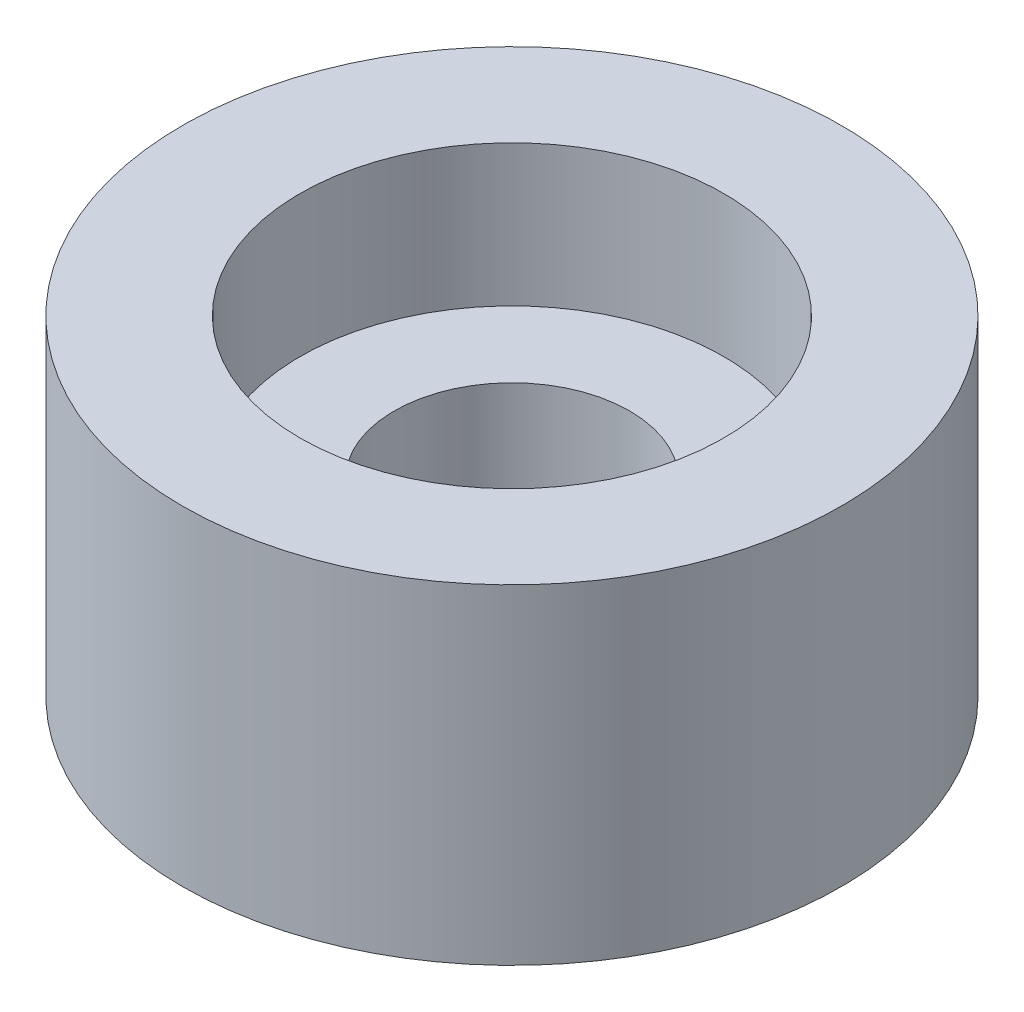
ISO-10303-21;
HEADER;
FILE_DESCRIPTION(('STEP AP214'),'2;1');
FILE_NAME('part.step','',(''),(''),'','','');
FILE_SCHEMA(('AUTOMOTIVE_DESIGN { 1 0 10303 214 1 1 1 1 }'));
ENDSEC;
DATA;
#1=APPLICATION_CONTEXT('core data for automotive mechanical design processes');
#2=APPLICATION_PROTOCOL_DEFINITION('international standard','automotive_design',2000,#1);
#3=PRODUCT_CONTEXT('',#1,'mechanical');
#4=PRODUCT('Part','Part','',(#3));
#5=PRODUCT_RELATED_PRODUCT_CATEGORY('part','',(#4));
#6=PRODUCT_DEFINITION_FORMATION('','',#4);
#7=PRODUCT_DEFINITION_CONTEXT('part definition',#1,'design');
#8=PRODUCT_DEFINITION('design','',#6,#7);
#9=PRODUCT_DEFINITION_SHAPE('','',#8);
#10=(LENGTH_UNIT() NAMED_UNIT(*) SI_UNIT(.MILLI.,.METRE.));
#11=(NAMED_UNIT(*) PLANE_ANGLE_UNIT() SI_UNIT($,.RADIAN.));
#12=(NAMED_UNIT(*) SI_UNIT($,.STERADIAN.) SOLID_ANGLE_UNIT());
#13=UNCERTAINTY_MEASURE_WITH_UNIT(LENGTH_MEASURE(1.E-05),#10,'distance_accuracy_value','');
#14=(GEOMETRIC_REPRESENTATION_CONTEXT(3) GLOBAL_UNCERTAINTY_ASSIGNED_CONTEXT((#13)) GLOBAL_UNIT_ASSIGNED_CONTEXT((#10,
#11,#12)) REPRESENTATION_CONTEXT('',''));
#15=CARTESIAN_POINT('',(0.,0.,0.));
#16=DIRECTION('',(0.,0.,1.));
#17=DIRECTION('',(1.,0.,0.));
#18=AXIS2_PLACEMENT_3D('',#15,#16,#17);
#19=CARTESIAN_POINT('',(0.,2.,0.));
#20=DIRECTION('',(0.,-1.,0.));
#21=DIRECTION('',(0.,0.,-1.));
#22=AXIS2_PLACEMENT_3D('',#19,#20,#21);
#23=CYLINDRICAL_SURFACE('',#22,3.5);
#24=CARTESIAN_POINT('',(0.,0.,0.));
#25=DIRECTION('',(0.,1.,0.));
#26=DIRECTION('',(0.,0.,1.));
#27=AXIS2_PLACEMENT_3D('',#24,#25,#26);
#28=CIRCLE('',#27,3.5);
#29=CARTESIAN_POINT('',(0.,0.,3.5));
#30=VERTEX_POINT('',#29);
#31=EDGE_CURVE('E39',#30,#30,#28,.T.);
#32=ORIENTED_EDGE('',*,*,#31,.T.);
#33=EDGE_LOOP('',(#32));
#34=FACE_BOUND('',#33,.T.);
#35=CARTESIAN_POINT('',(0.,3.5,0.));
#36=DIRECTION('',(0.,1.,0.));
#37=DIRECTION('',(0.,0.,1.));
#38=AXIS2_PLACEMENT_3D('',#35,#36,#37);
#39=CIRCLE('',#38,3.5);
#40=CARTESIAN_POINT('',(0.,3.5,3.5));
#41=VERTEX_POINT('',#40);
#42=EDGE_CURVE('E43',#41,#41,#39,.T.);
#43=ORIENTED_EDGE('',*,*,#42,.F.);
#44=EDGE_LOOP('',(#43));
#45=FACE_BOUND('',#44,.T.);
#46=ADVANCED_FACE('F33',(#34,#45),#23,.T.);
#47=CARTESIAN_POINT('',(0.,0.,0.));
#48=DIRECTION('',(0.,1.,0.));
#49=DIRECTION('',(0.,0.,1.));
#50=AXIS2_PLACEMENT_3D('',#47,#48,#49);
#51=PLANE('',#50);
#52=CARTESIAN_POINT('',(0.,0.,0.));
#53=DIRECTION('',(0.,-1.,0.));
#54=DIRECTION('',(0.,0.,-1.));
#55=AXIS2_PLACEMENT_3D('',#52,#53,#54);
#56=CIRCLE('',#55,2.);
#57=CARTESIAN_POINT('',(0.,0.,-2.));
#58=VERTEX_POINT('',#57);
#59=EDGE_CURVE('E53',#58,#58,#56,.T.);
#60=ORIENTED_EDGE('',*,*,#59,.F.);
#61=EDGE_LOOP('',(#60));
#62=FACE_BOUND('',#61,.T.);
#63=ORIENTED_EDGE('',*,*,#31,.F.);
#64=EDGE_LOOP('',(#63));
#65=FACE_BOUND('',#64,.T.);
#66=ADVANCED_FACE('F86',(#62,#65),#51,.F.);
#67=CARTESIAN_POINT('',(0.,3.5,0.));
#68=DIRECTION('',(0.,1.,0.));
#69=DIRECTION('',(0.,0.,1.));
#70=AXIS2_PLACEMENT_3D('',#67,#68,#69);
#71=PLANE('',#70);
#72=ORIENTED_EDGE('',*,*,#42,.T.);
#73=EDGE_LOOP('',(#72));
#74=FACE_BOUND('',#73,.T.);
#75=CARTESIAN_POINT('',(0.,3.5,0.));
#76=DIRECTION('',(0.,1.,0.));
#77=DIRECTION('',(0.,0.,1.));
#78=AXIS2_PLACEMENT_3D('',#75,#76,#77);
#79=CIRCLE('',#78,2.25);
#80=CARTESIAN_POINT('',(0.,3.5,2.25));
#81=VERTEX_POINT('',#80);
#82=EDGE_CURVE('E47',#81,#81,#79,.T.);
#83=ORIENTED_EDGE('',*,*,#82,.F.);
#84=EDGE_LOOP('',(#83));
#85=FACE_BOUND('',#84,.T.);
#86=ADVANCED_FACE('F89',(#74,#85),#71,.T.);
#87=CARTESIAN_POINT('',(0.,3.5,0.));
#88=DIRECTION('',(0.,-1.,0.));
#89=DIRECTION('',(0.,0.,-1.));
#90=AXIS2_PLACEMENT_3D('',#87,#88,#89);
#91=CYLINDRICAL_SURFACE('',#90,2.25);
#92=ORIENTED_EDGE('',*,*,#82,.T.);
#93=EDGE_LOOP('',(#92));
#94=FACE_BOUND('',#93,.T.);
#95=CARTESIAN_POINT('',(0.,2.,0.));
#96=DIRECTION('',(0.,1.,0.));
#97=DIRECTION('',(0.,0.,1.));
#98=AXIS2_PLACEMENT_3D('',#95,#96,#97);
#99=CIRCLE('',#98,2.25);
#100=CARTESIAN_POINT('',(0.,2.,2.25));
#101=VERTEX_POINT('',#100);
#102=EDGE_CURVE('E10',#101,#101,#99,.F.);
#103=ORIENTED_EDGE('',*,*,#102,.T.);
#104=EDGE_LOOP('',(#103));
#105=FACE_BOUND('',#104,.T.);
#106=ADVANCED_FACE('F94',(#94,#105),#91,.F.);
#107=CARTESIAN_POINT('',(0.,2.,0.));
#108=DIRECTION('',(0.,1.,0.));
#109=DIRECTION('',(0.,0.,1.));
#110=AXIS2_PLACEMENT_3D('',#107,#108,#109);
#111=PLANE('',#110);
#112=CARTESIAN_POINT('',(0.,2.,0.));
#113=DIRECTION('',(0.,-1.,0.));
#114=DIRECTION('',(0.,0.,-1.));
#115=AXIS2_PLACEMENT_3D('',#112,#113,#114);
#116=CIRCLE('',#115,1.25);
#117=CARTESIAN_POINT('',(0.,2.,-1.25));
#118=VERTEX_POINT('',#117);
#119=EDGE_CURVE('E56',#118,#118,#116,.T.);
#120=ORIENTED_EDGE('',*,*,#119,.T.);
#121=EDGE_LOOP('',(#120));
#122=FACE_BOUND('',#121,.T.);
#123=ORIENTED_EDGE('',*,*,#102,.F.);
#124=EDGE_LOOP('',(#123));
#125=FACE_BOUND('',#124,.T.);
#126=ADVANCED_FACE('F65',(#122,#125),#111,.T.);
#127=CARTESIAN_POINT('',(0.,1.,0.));
#128=DIRECTION('',(0.,-1.,0.));
#129=DIRECTION('',(0.,0.,-1.));
#130=AXIS2_PLACEMENT_3D('',#127,#128,#129);
#131=CYLINDRICAL_SURFACE('',#130,2.);
#132=CARTESIAN_POINT('',(0.,1.,0.));
#133=DIRECTION('',(0.,-1.,0.));
#134=DIRECTION('',(0.,0.,-1.));
#135=AXIS2_PLACEMENT_3D('',#132,#133,#134);
#136=CIRCLE('',#135,2.);
#137=CARTESIAN_POINT('',(0.,1.,-2.));
#138=VERTEX_POINT('',#137);
#139=EDGE_CURVE('E52',#138,#138,#136,.T.);
#140=ORIENTED_EDGE('',*,*,#139,.F.);
#141=EDGE_LOOP('',(#140));
#142=FACE_BOUND('',#141,.T.);
#143=ORIENTED_EDGE('',*,*,#59,.T.);
#144=EDGE_LOOP('',(#143));
#145=FACE_BOUND('',#144,.T.);
#146=ADVANCED_FACE('F77',(#142,#145),#131,.F.);
#147=CARTESIAN_POINT('',(0.,1.,0.));
#148=DIRECTION('',(0.,-1.,0.));
#149=DIRECTION('',(0.,0.,-1.));
#150=AXIS2_PLACEMENT_3D('',#147,#148,#149);
#151=PLANE('',#150);
#152=CARTESIAN_POINT('',(0.,1.,0.));
#153=DIRECTION('',(0.,-1.,0.));
#154=DIRECTION('',(0.,0.,-1.));
#155=AXIS2_PLACEMENT_3D('',#152,#153,#154);
#156=CIRCLE('',#155,1.25);
#157=CARTESIAN_POINT('',(0.,1.,-1.25));
#158=VERTEX_POINT('',#157);
#159=EDGE_CURVE('E59',#158,#158,#156,.T.);
#160=ORIENTED_EDGE('',*,*,#159,.F.);
#161=EDGE_LOOP('',(#160));
#162=FACE_BOUND('',#161,.T.);
#163=ORIENTED_EDGE('',*,*,#139,.T.);
#164=EDGE_LOOP('',(#163));
#165=FACE_BOUND('',#164,.T.);
#166=ADVANCED_FACE('F71',(#162,#165),#151,.T.);
#167=CARTESIAN_POINT('',(0.,2.,0.));
#168=DIRECTION('',(0.,-1.,0.));
#169=DIRECTION('',(0.,0.,-1.));
#170=AXIS2_PLACEMENT_3D('',#167,#168,#169);
#171=CYLINDRICAL_SURFACE('',#170,1.25);
#172=ORIENTED_EDGE('',*,*,#119,.F.);
#173=EDGE_LOOP('',(#172));
#174=FACE_BOUND('',#173,.T.);
#175=ORIENTED_EDGE('',*,*,#159,.T.);
#176=EDGE_LOOP('',(#175));
#177=FACE_BOUND('',#176,.T.);
#178=ADVANCED_FACE('F68',(#174,#177),#171,.F.);
#179=CLOSED_SHELL('',(#46,#66,#86,#106,#126,#146,#166,#178));
#180=MANIFOLD_SOLID_BREP('B2',#179);
#181=ADVANCED_BREP_SHAPE_REPRESENTATION('',(#18,#180),#14);
#182=SHAPE_DEFINITION_REPRESENTATION(#9,#181);
ENDSEC;
END-ISO-10303-21;
